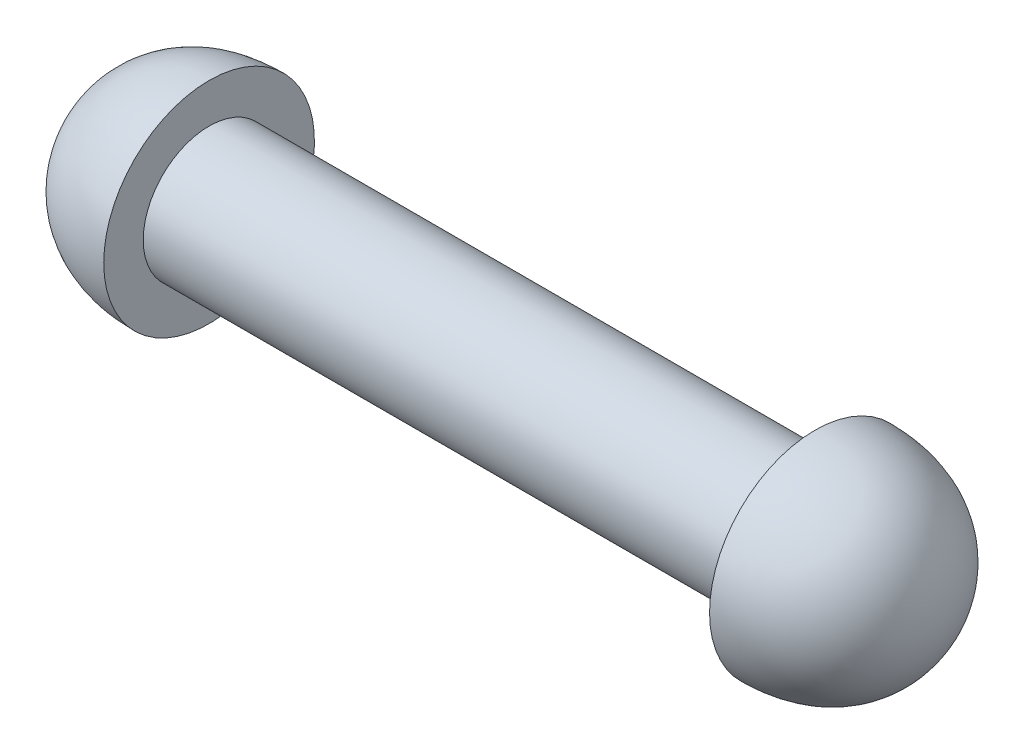
ISO-10303-21;
HEADER;
FILE_DESCRIPTION(('STEP AP214'),'2;1');
FILE_NAME('part.step','',(''),(''),'','','');
FILE_SCHEMA(('AUTOMOTIVE_DESIGN { 1 0 10303 214 1 1 1 1 }'));
ENDSEC;
DATA;
#1=APPLICATION_CONTEXT('core data for automotive mechanical design processes');
#2=APPLICATION_PROTOCOL_DEFINITION('international standard','automotive_design',2000,#1);
#3=PRODUCT_CONTEXT('',#1,'mechanical');
#4=PRODUCT('Part','Part','',(#3));
#5=PRODUCT_RELATED_PRODUCT_CATEGORY('part','',(#4));
#6=PRODUCT_DEFINITION_FORMATION('','',#4);
#7=PRODUCT_DEFINITION_CONTEXT('part definition',#1,'design');
#8=PRODUCT_DEFINITION('design','',#6,#7);
#9=PRODUCT_DEFINITION_SHAPE('','',#8);
#10=(LENGTH_UNIT() NAMED_UNIT(*) SI_UNIT(.MILLI.,.METRE.));
#11=(NAMED_UNIT(*) PLANE_ANGLE_UNIT() SI_UNIT($,.RADIAN.));
#12=(NAMED_UNIT(*) SI_UNIT($,.STERADIAN.) SOLID_ANGLE_UNIT());
#13=UNCERTAINTY_MEASURE_WITH_UNIT(LENGTH_MEASURE(1.E-05),#10,'distance_accuracy_value','');
#14=(GEOMETRIC_REPRESENTATION_CONTEXT(3) GLOBAL_UNCERTAINTY_ASSIGNED_CONTEXT((#13)) GLOBAL_UNIT_ASSIGNED_CONTEXT((#10,
#11,#12)) REPRESENTATION_CONTEXT('',''));
#15=CARTESIAN_POINT('',(0.,0.,0.));
#16=DIRECTION('',(0.,0.,1.));
#17=DIRECTION('',(1.,0.,0.));
#18=AXIS2_PLACEMENT_3D('',#15,#16,#17);
#19=CARTESIAN_POINT('',(115.,0.,0.));
#20=DIRECTION('',(-1.,0.,0.));
#21=DIRECTION('',(0.,0.,1.));
#22=AXIS2_PLACEMENT_3D('',#19,#20,#21);
#23=CYLINDRICAL_SURFACE('',#22,25.);
#24=CARTESIAN_POINT('',(0.,0.,0.));
#25=DIRECTION('',(-1.,0.,0.));
#26=DIRECTION('',(0.,0.,1.));
#27=AXIS2_PLACEMENT_3D('',#24,#25,#26);
#28=CIRCLE('',#27,25.);
#29=CARTESIAN_POINT('',(0.,0.,25.));
#30=VERTEX_POINT('',#29);
#31=EDGE_CURVE('E11',#30,#30,#28,.T.);
#32=ORIENTED_EDGE('',*,*,#31,.F.);
#33=EDGE_LOOP('',(#32));
#34=FACE_BOUND('',#33,.T.);
#35=CARTESIAN_POINT('',(230.,0.,0.));
#36=DIRECTION('',(1.,0.,0.));
#37=DIRECTION('',(0.,0.,-1.));
#38=AXIS2_PLACEMENT_3D('',#35,#36,#37);
#39=CIRCLE('',#38,25.);
#40=CARTESIAN_POINT('',(230.,0.,-25.));
#41=VERTEX_POINT('',#40);
#42=EDGE_CURVE('E64',#41,#41,#39,.T.);
#43=ORIENTED_EDGE('',*,*,#42,.F.);
#44=EDGE_LOOP('',(#43));
#45=FACE_BOUND('',#44,.T.);
#46=ADVANCED_FACE('F39',(#34,#45),#23,.T.);
#47=CARTESIAN_POINT('',(0.,40.,0.));
#48=CARTESIAN_POINT('',(-30.9912388312532,40.,0.));
#49=CARTESIAN_POINT('',(-45.4583925127281,20.1837818553006,0.));
#50=CARTESIAN_POINT('',(-45.4583925127281,0.,0.));
#51=B_SPLINE_CURVE_WITH_KNOTS('',3,(#47,#48,#49,#50),.UNSPECIFIED.,.F.,.F.,(4,4),(0.,1.),.UNSPECIFIED.);
#52=CARTESIAN_POINT('',(-100.078673333577,0.,0.));
#53=DIRECTION('',(-1.,0.,0.));
#54=AXIS1_PLACEMENT('',#52,#53);
#55=SURFACE_OF_REVOLUTION('',#51,#54);
#56=CARTESIAN_POINT('',(-45.4583925127281,0.,0.));
#57=VERTEX_POINT('',#56);
#58=VERTEX_LOOP('',#57);
#59=FACE_BOUND('',#58,.T.);
#60=CARTESIAN_POINT('',(0.,0.,0.));
#61=DIRECTION('',(-1.,0.,0.));
#62=DIRECTION('',(0.,0.,1.));
#63=AXIS2_PLACEMENT_3D('',#60,#61,#62);
#64=CIRCLE('',#63,40.);
#65=CARTESIAN_POINT('',(0.,0.,40.));
#66=VERTEX_POINT('',#65);
#67=EDGE_CURVE('E47',#66,#66,#64,.T.);
#68=ORIENTED_EDGE('',*,*,#67,.T.);
#69=EDGE_LOOP('',(#68));
#70=FACE_BOUND('',#69,.T.);
#71=ADVANCED_FACE('F80',(#59,#70),#55,.T.);
#72=CARTESIAN_POINT('',(0.,40.,0.));
#73=DIRECTION('',(-1.,0.,0.));
#74=DIRECTION('',(0.,0.,1.));
#75=AXIS2_PLACEMENT_3D('',#72,#73,#74);
#76=PLANE('',#75);
#77=ORIENTED_EDGE('',*,*,#31,.T.);
#78=EDGE_LOOP('',(#77));
#79=FACE_BOUND('',#78,.T.);
#80=ORIENTED_EDGE('',*,*,#67,.F.);
#81=EDGE_LOOP('',(#80));
#82=FACE_BOUND('',#81,.T.);
#83=ADVANCED_FACE('F57',(#79,#82),#76,.F.);
#84=CARTESIAN_POINT('',(230.,40.,0.));
#85=CARTESIAN_POINT('',(260.991238831253,40.,0.));
#86=CARTESIAN_POINT('',(275.458392512728,20.1837818553006,0.));
#87=CARTESIAN_POINT('',(275.458392512728,0.,0.));
#88=B_SPLINE_CURVE_WITH_KNOTS('',3,(#84,#85,#86,#87),.UNSPECIFIED.,.F.,.F.,(4,4),(0.,1.),.UNSPECIFIED.);
#89=CARTESIAN_POINT('',(330.078673333577,0.,0.));
#90=DIRECTION('',(1.,0.,0.));
#91=AXIS1_PLACEMENT('',#89,#90);
#92=SURFACE_OF_REVOLUTION('',#88,#91);
#93=CARTESIAN_POINT('',(275.458392512728,0.,0.));
#94=VERTEX_POINT('',#93);
#95=VERTEX_LOOP('',#94);
#96=FACE_BOUND('',#95,.T.);
#97=CARTESIAN_POINT('',(230.,0.,0.));
#98=DIRECTION('',(-1.,0.,0.));
#99=DIRECTION('',(0.,0.,1.));
#100=AXIS2_PLACEMENT_3D('',#97,#98,#99);
#101=CIRCLE('',#100,40.);
#102=CARTESIAN_POINT('',(230.,0.,40.));
#103=VERTEX_POINT('',#102);
#104=EDGE_CURVE('E61',#103,#103,#101,.T.);
#105=ORIENTED_EDGE('',*,*,#104,.F.);
#106=EDGE_LOOP('',(#105));
#107=FACE_BOUND('',#106,.T.);
#108=ADVANCED_FACE('F53',(#96,#107),#92,.T.);
#109=CARTESIAN_POINT('',(230.,40.,0.));
#110=DIRECTION('',(1.,0.,0.));
#111=DIRECTION('',(0.,0.,1.));
#112=AXIS2_PLACEMENT_3D('',#109,#110,#111);
#113=PLANE('',#112);
#114=ORIENTED_EDGE('',*,*,#42,.T.);
#115=EDGE_LOOP('',(#114));
#116=FACE_BOUND('',#115,.T.);
#117=ORIENTED_EDGE('',*,*,#104,.T.);
#118=EDGE_LOOP('',(#117));
#119=FACE_BOUND('',#118,.T.);
#120=ADVANCED_FACE('F56',(#116,#119),#113,.F.);
#121=CLOSED_SHELL('',(#46,#71,#83,#108,#120));
#122=MANIFOLD_SOLID_BREP('B2',#121);
#123=ADVANCED_BREP_SHAPE_REPRESENTATION('',(#18,#122),#14);
#124=SHAPE_DEFINITION_REPRESENTATION(#9,#123);
ENDSEC;
END-ISO-10303-21;
